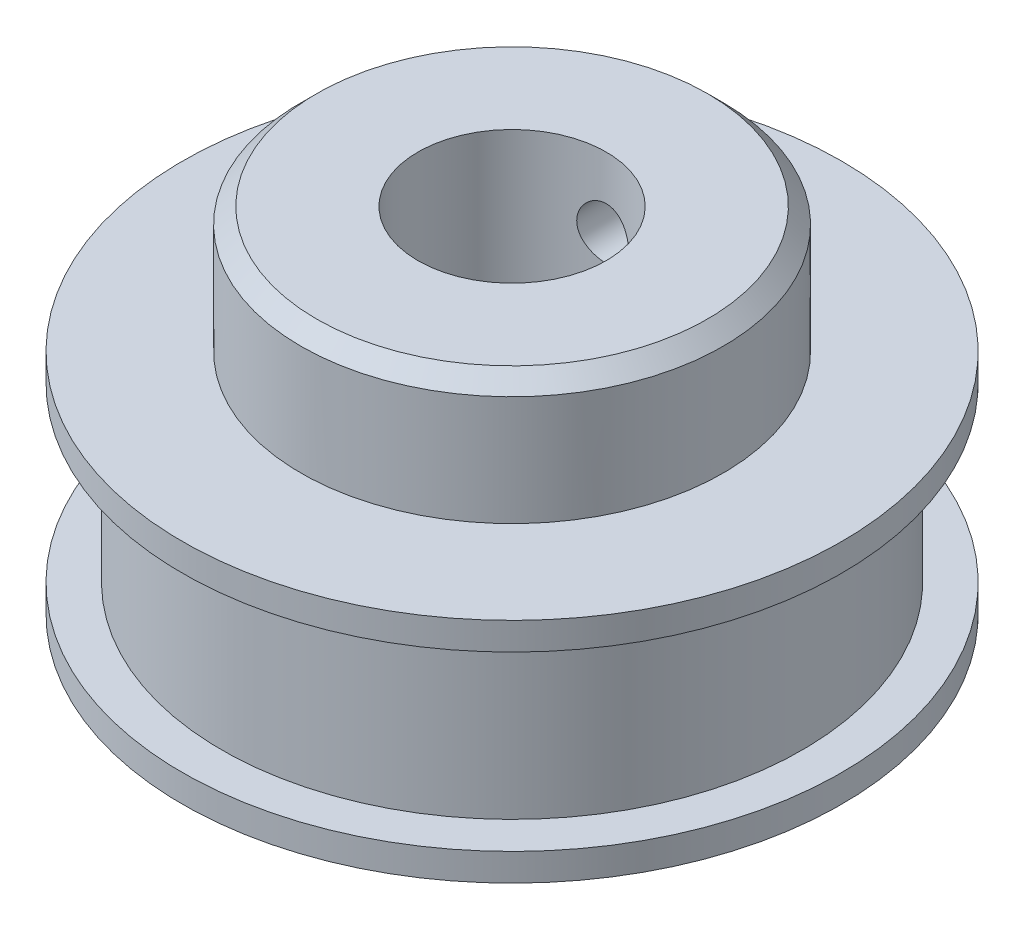
ISO-10303-21;
HEADER;
FILE_DESCRIPTION(('STEP AP214'),'2;1');
FILE_NAME('part.step','',(''),(''),'','','');
FILE_SCHEMA(('AUTOMOTIVE_DESIGN { 1 0 10303 214 1 1 1 1 }'));
ENDSEC;
DATA;
#1=APPLICATION_CONTEXT('core data for automotive mechanical design processes');
#2=APPLICATION_PROTOCOL_DEFINITION('international standard','automotive_design',2000,#1);
#3=PRODUCT_CONTEXT('',#1,'mechanical');
#4=PRODUCT('Part','Part','',(#3));
#5=PRODUCT_RELATED_PRODUCT_CATEGORY('part','',(#4));
#6=PRODUCT_DEFINITION_FORMATION('','',#4);
#7=PRODUCT_DEFINITION_CONTEXT('part definition',#1,'design');
#8=PRODUCT_DEFINITION('design','',#6,#7);
#9=PRODUCT_DEFINITION_SHAPE('','',#8);
#10=(LENGTH_UNIT() NAMED_UNIT(*) SI_UNIT(.MILLI.,.METRE.));
#11=(NAMED_UNIT(*) PLANE_ANGLE_UNIT() SI_UNIT($,.RADIAN.));
#12=(NAMED_UNIT(*) SI_UNIT($,.STERADIAN.) SOLID_ANGLE_UNIT());
#13=UNCERTAINTY_MEASURE_WITH_UNIT(LENGTH_MEASURE(1.E-05),#10,'distance_accuracy_value','');
#14=(GEOMETRIC_REPRESENTATION_CONTEXT(3) GLOBAL_UNCERTAINTY_ASSIGNED_CONTEXT((#13)) GLOBAL_UNIT_ASSIGNED_CONTEXT((#10,
#11,#12)) REPRESENTATION_CONTEXT('',''));
#15=CARTESIAN_POINT('',(0.,0.,0.));
#16=DIRECTION('',(0.,0.,1.));
#17=DIRECTION('',(1.,0.,0.));
#18=AXIS2_PLACEMENT_3D('',#15,#16,#17);
#19=CARTESIAN_POINT('',(0.,11.25,0.));
#20=DIRECTION('',(0.,1.,0.));
#21=DIRECTION('',(0.,0.,1.));
#22=AXIS2_PLACEMENT_3D('',#19,#20,#21);
#23=PLANE('',#22);
#24=CARTESIAN_POINT('',(0.,11.25,0.));
#25=DIRECTION('',(0.,1.,0.));
#26=DIRECTION('',(0.,0.,1.));
#27=AXIS2_PLACEMENT_3D('',#24,#25,#26);
#28=CIRCLE('',#27,6.);
#29=CARTESIAN_POINT('',(0.,11.25,6.));
#30=VERTEX_POINT('',#29);
#31=EDGE_CURVE('E80',#30,#30,#28,.T.);
#32=ORIENTED_EDGE('',*,*,#31,.F.);
#33=EDGE_LOOP('',(#32));
#34=FACE_BOUND('',#33,.T.);
#35=CARTESIAN_POINT('',(0.,11.25,0.));
#36=DIRECTION('',(0.,1.,0.));
#37=DIRECTION('',(0.,0.,1.));
#38=AXIS2_PLACEMENT_3D('',#35,#36,#37);
#39=CIRCLE('',#38,12.45);
#40=CARTESIAN_POINT('',(0.,11.25,12.45));
#41=VERTEX_POINT('',#40);
#42=EDGE_CURVE('E10',#41,#41,#39,.T.);
#43=ORIENTED_EDGE('',*,*,#42,.T.);
#44=EDGE_LOOP('',(#43));
#45=FACE_BOUND('',#44,.T.);
#46=ADVANCED_FACE('F38',(#34,#45),#23,.T.);
#47=CARTESIAN_POINT('',(0.,-12.375,0.));
#48=DIRECTION('',(0.,-1.,0.));
#49=DIRECTION('',(0.,0.,-1.));
#50=AXIS2_PLACEMENT_3D('',#47,#48,#49);
#51=CYLINDRICAL_SURFACE('',#50,13.45);
#52=CARTESIAN_POINT('',(0.,8.4,-13.45));
#53=CARTESIAN_POINT('',(0.0923092606846522,8.39999606989156,-13.4499987318262));
#54=CARTESIAN_POINT('',(0.184676546565116,8.39222752254949,-13.4490396601292));
#55=CARTESIAN_POINT('',(0.366841822033255,8.36135934683921,-13.4453059823572));
#56=CARTESIAN_POINT('',(0.456637010359747,8.33824362017226,-13.4425294699356));
#57=CARTESIAN_POINT('',(0.630994428152322,8.27737154568672,-13.4354737642154));
#58=CARTESIAN_POINT('',(0.715560099781557,8.23962494971325,-13.4311955720033));
#59=CARTESIAN_POINT('',(0.877140082819454,8.15058371541106,-13.4216125888811));
#60=CARTESIAN_POINT('',(0.954155707326011,8.09929143868824,-13.4163079769639));
#61=CARTESIAN_POINT('',(1.09887473843124,7.98432350451151,-13.4052331083348));
#62=CARTESIAN_POINT('',(1.16653227898811,7.92059030725544,-13.3994607638233));
#63=CARTESIAN_POINT('',(1.29021965720093,7.78267316407076,-13.3881178862387));
#64=CARTESIAN_POINT('',(1.3462489080705,7.7084886910672,-13.3825473633617));
#65=CARTESIAN_POINT('',(1.44525931032078,7.55147777239056,-13.3722182299544));
#66=CARTESIAN_POINT('',(1.48819762643743,7.4686241229816,-13.3674623066793));
#67=CARTESIAN_POINT('',(1.55953374744784,7.29681393267107,-13.3593282504242));
#68=CARTESIAN_POINT('',(1.58793208386536,7.20785761499358,-13.3559500670804));
#69=CARTESIAN_POINT('',(1.62924305851266,7.02684254400976,-13.3509738304528));
#70=CARTESIAN_POINT('',(1.64223302212707,6.93480168630368,-13.3493668912592));
#71=CARTESIAN_POINT('',(1.65259776008657,6.74983340414768,-13.3480878588677));
#72=CARTESIAN_POINT('',(1.64997314003763,6.65690601422117,-13.3484156906304));
#73=CARTESIAN_POINT('',(1.62924671453376,6.47334082873499,-13.3509610283831));
#74=CARTESIAN_POINT('',(1.61123000940919,6.3826932599305,-13.3531681438955));
#75=CARTESIAN_POINT('',(1.56036358203791,6.20571796726024,-13.3592071549006));
#76=CARTESIAN_POINT('',(1.52751356938961,6.11939032800538,-13.3630390822031));
#77=CARTESIAN_POINT('',(1.44782129743991,5.95324059148484,-13.3719077551923));
#78=CARTESIAN_POINT('',(1.40094197823018,5.8734364465625,-13.3769476848372));
#79=CARTESIAN_POINT('',(1.29454834829898,5.72279573680187,-13.387662006051));
#80=CARTESIAN_POINT('',(1.23503348084826,5.65195956731714,-13.3933364255707));
#81=CARTESIAN_POINT('',(1.10458615859966,5.52077157990349,-13.4047265640634));
#82=CARTESIAN_POINT('',(1.03358033713523,5.46049269247193,-13.4104423065102));
#83=CARTESIAN_POINT('',(0.882419530715335,5.35269795321998,-13.421235697483));
#84=CARTESIAN_POINT('',(0.802264525964526,5.30518212901474,-13.4263133446283));
#85=CARTESIAN_POINT('',(0.635024999510896,5.22426256591315,-13.4352614196214));
#86=CARTESIAN_POINT('',(0.547938289333149,5.19086330506102,-13.4391314642928));
#87=CARTESIAN_POINT('',(0.3693346923303,5.13918239287224,-13.4452247727249));
#88=CARTESIAN_POINT('',(0.277818005423388,5.12090006000337,-13.4474481107253));
#89=CARTESIAN_POINT('',(0.0935829703302501,5.10006629118723,-13.4499878579134));
#90=CARTESIAN_POINT('',(0.000876146276728533,5.09741437220646,-13.4503164475478));
#91=CARTESIAN_POINT('',(-0.183660609696694,5.10765166184763,-13.4490625385916));
#92=CARTESIAN_POINT('',(-0.275490559549179,5.12054055196202,-13.4474800791678));
#93=CARTESIAN_POINT('',(-0.455371019516503,5.16141012686836,-13.4425894893476));
#94=CARTESIAN_POINT('',(-0.543432556703835,5.18934298804758,-13.4392868284265));
#95=CARTESIAN_POINT('',(-0.713621209965722,5.25945793163178,-13.4313256660794));
#96=CARTESIAN_POINT('',(-0.795748131212371,5.301640481583,-13.4266671201659));
#97=CARTESIAN_POINT('',(-0.952185601351656,5.39930112738369,-13.4164833637743));
#98=CARTESIAN_POINT('',(-1.02645523001572,5.45484432614539,-13.4109539568387));
#99=CARTESIAN_POINT('',(-1.16465376419515,5.57755737276608,-13.3996603848827));
#100=CARTESIAN_POINT('',(-1.2285822747215,5.64472766453039,-13.3938962109055));
#101=CARTESIAN_POINT('',(-1.34463961437588,5.78923038063816,-13.3827452759908));
#102=CARTESIAN_POINT('',(-1.39670190188454,5.86661644582719,-13.377360754952));
#103=CARTESIAN_POINT('',(-1.48708947309349,6.0290932732003,-13.3676153586065));
#104=CARTESIAN_POINT('',(-1.52541502358073,6.11418388571093,-13.3632544634201));
#105=CARTESIAN_POINT('',(-1.58713309499605,6.2894383202972,-13.3560652169377));
#106=CARTESIAN_POINT('',(-1.61056334369739,6.37958869058734,-13.3532329964891));
#107=CARTESIAN_POINT('',(-1.64194730698151,6.56258116743755,-13.3494105895796));
#108=CARTESIAN_POINT('',(-1.64990171292012,6.65542315356641,-13.3484203208328));
#109=CARTESIAN_POINT('',(-1.65009582779569,6.84050149096557,-13.3483962729262));
#110=CARTESIAN_POINT('',(-1.64244007353199,6.93273774839408,-13.3493494788668));
#111=CARTESIAN_POINT('',(-1.61185233199219,7.11460212713943,-13.3530770204912));
#112=CARTESIAN_POINT('',(-1.58892034124114,7.20423024786299,-13.3558513565892));
#113=CARTESIAN_POINT('',(-1.52846338782943,7.37832168451034,-13.3629045779662));
#114=CARTESIAN_POINT('',(-1.49094326479907,7.46278670255674,-13.3671829642298));
#115=CARTESIAN_POINT('',(-1.40238541414801,7.62423855105335,-13.3767630641329));
#116=CARTESIAN_POINT('',(-1.35134754184961,7.70122530145313,-13.3820647887248));
#117=CARTESIAN_POINT('',(-1.23681455747847,7.8460698163772,-13.3931367411319));
#118=CARTESIAN_POINT('',(-1.17324151661805,7.91386575090879,-13.3989097601505));
#119=CARTESIAN_POINT('',(-1.03560482830966,8.03786788561699,-13.4102490819286));
#120=CARTESIAN_POINT('',(-0.961538707336214,8.09407134541484,-13.4158153355559));
#121=CARTESIAN_POINT('',(-0.804707912187814,8.19346753605082,-13.4261363991204));
#122=CARTESIAN_POINT('',(-0.721912336762905,8.23661180141906,-13.4308881586852));
#123=CARTESIAN_POINT('',(-0.550239848962248,8.30832314807712,-13.4390137556234));
#124=CARTESIAN_POINT('',(-0.461369690725895,8.33690612994305,-13.4423890952073));
#125=CARTESIAN_POINT('',(-0.310029334491708,8.37181241152802,-13.4465643492695));
#126=CARTESIAN_POINT('',(-0.248514914853924,8.38236764276486,-13.4478464692165));
#127=CARTESIAN_POINT('',(-0.124675817596508,8.39646273973653,-13.4495647199177));
#128=CARTESIAN_POINT('',(-0.0623511456574501,8.40000265462817,-13.4500008565998));
#129=CARTESIAN_POINT('',(0.,8.4,-13.45));
#130=B_SPLINE_CURVE_WITH_KNOTS('',3,(#52,#53,#54,#55,#56,#57,#58,#59,#60,#61,#62,#63,#64,#65,
#66,#67,#68,#69,#70,#71,#72,#73,#74,#75,#76,#77,#78,#79,#80,#81,#82,#83,#84,#85,#86,#87,#88,#89,
#90,#91,#92,#93,#94,#95,#96,#97,#98,#99,#100,#101,#102,#103,#104,#105,#106,#107,#108,#109,#110,
#111,#112,#113,#114,#115,#116,#117,#118,#119,#120,#121,#122,#123,#124,#125,#126,#127,#128,#129),
.UNSPECIFIED.,.T.,.F.,(4,2,2,2,2,2,2,2,2,2,2,2,2,2,2,2,2,2,2,2,2,2,2,2,2,2,2,2,2,2,2,2,2,2,2,2,
2,2,4),(0.,0.276700039848801,0.553690781475281,0.830497218348917,1.10725542755036,
1.38532535416116,1.66340930931717,1.94239366032399,2.2213678120454,2.49893595553601,
2.77649333371692,3.0525260004692,3.3285640715321,3.60533786155207,3.88212384890976,
4.16075232836323,4.4393814106739,4.7180988132492,4.99680364943228,5.27371480831541,
5.55062029202468,5.8266506661095,6.10269009790101,6.38010286050754,6.65752621666219,
6.93646895544387,7.21540627646803,7.49363424238483,7.7718497786754,8.04820830450432,
8.32456689319753,8.60083387771954,8.87710381919007,9.15514874581255,9.43325932514204,
9.71238972281186,9.99121465982896,10.1781155758501,10.3650151822392),.UNSPECIFIED.);
#131=CARTESIAN_POINT('',(0.,8.4,-13.45));
#132=VERTEX_POINT('',#131);
#133=EDGE_CURVE('E83',#132,#132,#130,.T.);
#134=ORIENTED_EDGE('',*,*,#133,.F.);
#135=EDGE_LOOP('',(#134));
#136=FACE_BOUND('',#135,.T.);
#137=CARTESIAN_POINT('',(0.,10.25,0.));
#138=DIRECTION('',(0.,1.,0.));
#139=DIRECTION('',(0.,0.,1.));
#140=AXIS2_PLACEMENT_3D('',#137,#138,#139);
#141=CIRCLE('',#140,13.45);
#142=CARTESIAN_POINT('',(0.,10.25,13.45));
#143=VERTEX_POINT('',#142);
#144=EDGE_CURVE('E52',#143,#143,#141,.F.);
#145=ORIENTED_EDGE('',*,*,#144,.T.);
#146=EDGE_LOOP('',(#145));
#147=FACE_BOUND('',#146,.T.);
#148=CARTESIAN_POINT('',(0.,3.25,0.));
#149=DIRECTION('',(0.,-1.,0.));
#150=DIRECTION('',(0.,0.,-1.));
#151=AXIS2_PLACEMENT_3D('',#148,#149,#150);
#152=CIRCLE('',#151,13.45);
#153=CARTESIAN_POINT('',(0.,3.25,-13.45));
#154=VERTEX_POINT('',#153);
#155=EDGE_CURVE('E56',#154,#154,#152,.T.);
#156=ORIENTED_EDGE('',*,*,#155,.F.);
#157=EDGE_LOOP('',(#156));
#158=FACE_BOUND('',#157,.T.);
#159=ADVANCED_FACE('F91',(#136,#147,#158),#51,.T.);
#160=CARTESIAN_POINT('',(13.45,3.25,0.));
#161=DIRECTION('',(0.,1.,0.));
#162=DIRECTION('',(0.,0.,1.));
#163=AXIS2_PLACEMENT_3D('',#160,#161,#162);
#164=PLANE('',#163);
#165=ORIENTED_EDGE('',*,*,#155,.T.);
#166=EDGE_LOOP('',(#165));
#167=FACE_BOUND('',#166,.T.);
#168=CARTESIAN_POINT('',(0.,3.25,0.));
#169=DIRECTION('',(0.,-1.,0.));
#170=DIRECTION('',(0.,0.,-1.));
#171=AXIS2_PLACEMENT_3D('',#168,#169,#170);
#172=CIRCLE('',#171,21.);
#173=CARTESIAN_POINT('',(0.,3.25,-21.));
#174=VERTEX_POINT('',#173);
#175=EDGE_CURVE('E61',#174,#174,#172,.T.);
#176=ORIENTED_EDGE('',*,*,#175,.F.);
#177=EDGE_LOOP('',(#176));
#178=FACE_BOUND('',#177,.T.);
#179=ADVANCED_FACE('F126',(#167,#178),#164,.T.);
#180=CARTESIAN_POINT('',(0.,-12.375,0.));
#181=DIRECTION('',(0.,-1.,0.));
#182=DIRECTION('',(0.,0.,-1.));
#183=AXIS2_PLACEMENT_3D('',#180,#181,#182);
#184=CYLINDRICAL_SURFACE('',#183,21.);
#185=ORIENTED_EDGE('',*,*,#175,.T.);
#186=EDGE_LOOP('',(#185));
#187=FACE_BOUND('',#186,.T.);
#188=CARTESIAN_POINT('',(0.,1.5,0.));
#189=DIRECTION('',(0.,-1.,0.));
#190=DIRECTION('',(0.,0.,-1.));
#191=AXIS2_PLACEMENT_3D('',#188,#189,#190);
#192=CIRCLE('',#191,21.);
#193=CARTESIAN_POINT('',(0.,1.5,-21.));
#194=VERTEX_POINT('',#193);
#195=EDGE_CURVE('E64',#194,#194,#192,.T.);
#196=ORIENTED_EDGE('',*,*,#195,.F.);
#197=EDGE_LOOP('',(#196));
#198=FACE_BOUND('',#197,.T.);
#199=ADVANCED_FACE('F123',(#187,#198),#184,.T.);
#200=CARTESIAN_POINT('',(21.,1.5,0.));
#201=DIRECTION('',(0.,-1.,0.));
#202=DIRECTION('',(0.,0.,-1.));
#203=AXIS2_PLACEMENT_3D('',#200,#201,#202);
#204=PLANE('',#203);
#205=ORIENTED_EDGE('',*,*,#195,.T.);
#206=EDGE_LOOP('',(#205));
#207=FACE_BOUND('',#206,.T.);
#208=CARTESIAN_POINT('',(0.,1.5,0.));
#209=DIRECTION('',(0.,-1.,0.));
#210=DIRECTION('',(0.,0.,-1.));
#211=AXIS2_PLACEMENT_3D('',#208,#209,#210);
#212=CIRCLE('',#211,18.5);
#213=CARTESIAN_POINT('',(0.,1.5,-18.5));
#214=VERTEX_POINT('',#213);
#215=EDGE_CURVE('E67',#214,#214,#212,.T.);
#216=ORIENTED_EDGE('',*,*,#215,.F.);
#217=EDGE_LOOP('',(#216));
#218=FACE_BOUND('',#217,.T.);
#219=ADVANCED_FACE('F119',(#207,#218),#204,.T.);
#220=CARTESIAN_POINT('',(0.,-12.375,0.));
#221=DIRECTION('',(0.,-1.,0.));
#222=DIRECTION('',(0.,0.,-1.));
#223=AXIS2_PLACEMENT_3D('',#220,#221,#222);
#224=CYLINDRICAL_SURFACE('',#223,18.5);
#225=ORIENTED_EDGE('',*,*,#215,.T.);
#226=EDGE_LOOP('',(#225));
#227=FACE_BOUND('',#226,.T.);
#228=CARTESIAN_POINT('',(0.,-9.5,0.));
#229=DIRECTION('',(0.,-1.,0.));
#230=DIRECTION('',(0.,0.,-1.));
#231=AXIS2_PLACEMENT_3D('',#228,#229,#230);
#232=CIRCLE('',#231,18.5);
#233=CARTESIAN_POINT('',(0.,-9.5,-18.5));
#234=VERTEX_POINT('',#233);
#235=EDGE_CURVE('E70',#234,#234,#232,.T.);
#236=ORIENTED_EDGE('',*,*,#235,.F.);
#237=EDGE_LOOP('',(#236));
#238=FACE_BOUND('',#237,.T.);
#239=ADVANCED_FACE('F115',(#227,#238),#224,.T.);
#240=CARTESIAN_POINT('',(18.5,-9.5,0.));
#241=DIRECTION('',(0.,1.,0.));
#242=DIRECTION('',(0.,0.,1.));
#243=AXIS2_PLACEMENT_3D('',#240,#241,#242);
#244=PLANE('',#243);
#245=ORIENTED_EDGE('',*,*,#235,.T.);
#246=EDGE_LOOP('',(#245));
#247=FACE_BOUND('',#246,.T.);
#248=CARTESIAN_POINT('',(0.,-9.5,0.));
#249=DIRECTION('',(0.,-1.,0.));
#250=DIRECTION('',(0.,0.,-1.));
#251=AXIS2_PLACEMENT_3D('',#248,#249,#250);
#252=CIRCLE('',#251,21.);
#253=CARTESIAN_POINT('',(0.,-9.5,-21.));
#254=VERTEX_POINT('',#253);
#255=EDGE_CURVE('E73',#254,#254,#252,.T.);
#256=ORIENTED_EDGE('',*,*,#255,.F.);
#257=EDGE_LOOP('',(#256));
#258=FACE_BOUND('',#257,.T.);
#259=ADVANCED_FACE('F111',(#247,#258),#244,.T.);
#260=CARTESIAN_POINT('',(0.,-12.375,0.));
#261=DIRECTION('',(0.,-1.,0.));
#262=DIRECTION('',(0.,0.,-1.));
#263=AXIS2_PLACEMENT_3D('',#260,#261,#262);
#264=CYLINDRICAL_SURFACE('',#263,21.);
#265=ORIENTED_EDGE('',*,*,#255,.T.);
#266=EDGE_LOOP('',(#265));
#267=FACE_BOUND('',#266,.T.);
#268=CARTESIAN_POINT('',(0.,-11.25,0.));
#269=DIRECTION('',(0.,-1.,0.));
#270=DIRECTION('',(0.,0.,-1.));
#271=AXIS2_PLACEMENT_3D('',#268,#269,#270);
#272=CIRCLE('',#271,21.);
#273=CARTESIAN_POINT('',(0.,-11.25,-21.));
#274=VERTEX_POINT('',#273);
#275=EDGE_CURVE('E76',#274,#274,#272,.T.);
#276=ORIENTED_EDGE('',*,*,#275,.F.);
#277=EDGE_LOOP('',(#276));
#278=FACE_BOUND('',#277,.T.);
#279=ADVANCED_FACE('F107',(#267,#278),#264,.T.);
#280=CARTESIAN_POINT('',(21.,-11.25,0.));
#281=DIRECTION('',(0.,-1.,0.));
#282=DIRECTION('',(0.,0.,-1.));
#283=AXIS2_PLACEMENT_3D('',#280,#281,#282);
#284=PLANE('',#283);
#285=CARTESIAN_POINT('',(0.,-11.25,0.));
#286=DIRECTION('',(0.,1.,0.));
#287=DIRECTION('',(0.,0.,1.));
#288=AXIS2_PLACEMENT_3D('',#285,#286,#287);
#289=CIRCLE('',#288,6.);
#290=CARTESIAN_POINT('',(0.,-11.25,6.));
#291=VERTEX_POINT('',#290);
#292=EDGE_CURVE('E79',#291,#291,#289,.T.);
#293=ORIENTED_EDGE('',*,*,#292,.T.);
#294=EDGE_LOOP('',(#293));
#295=FACE_BOUND('',#294,.T.);
#296=ORIENTED_EDGE('',*,*,#275,.T.);
#297=EDGE_LOOP('',(#296));
#298=FACE_BOUND('',#297,.T.);
#299=ADVANCED_FACE('F104',(#295,#298),#284,.T.);
#300=CARTESIAN_POINT('',(0.,10.25,0.));
#301=DIRECTION('',(0.,-1.,0.));
#302=DIRECTION('',(0.,0.,-1.));
#303=AXIS2_PLACEMENT_3D('',#300,#301,#302);
#304=CONICAL_SURFACE('',#303,13.45,0.785398163397452);
#305=ORIENTED_EDGE('',*,*,#42,.F.);
#306=EDGE_LOOP('',(#305));
#307=FACE_BOUND('',#306,.T.);
#308=ORIENTED_EDGE('',*,*,#144,.F.);
#309=EDGE_LOOP('',(#308));
#310=FACE_BOUND('',#309,.T.);
#311=ADVANCED_FACE('F41',(#307,#310),#304,.T.);
#312=CARTESIAN_POINT('',(0.,-11.25,0.));
#313=DIRECTION('',(0.,1.,0.));
#314=DIRECTION('',(0.,0.,1.));
#315=AXIS2_PLACEMENT_3D('',#312,#313,#314);
#316=CYLINDRICAL_SURFACE('',#315,6.);
#317=CARTESIAN_POINT('',(1.65,6.75,-5.76866535690882));
#318=CARTESIAN_POINT('',(1.64999803744472,6.65921955335825,-5.76866681542244));
#319=CARTESIAN_POINT('',(1.64248258154128,6.56841876938433,-5.77083168489651));
#320=CARTESIAN_POINT('',(1.61268113160831,6.38944729227741,-5.77922931898767));
#321=CARTESIAN_POINT('',(1.59038833565189,6.30127782986673,-5.78546395687621));
#322=CARTESIAN_POINT('',(1.53182668713213,6.13018421281183,-5.8012427959002));
#323=CARTESIAN_POINT('',(1.49557833657748,6.04725257039649,-5.81078214006462));
#324=CARTESIAN_POINT('',(1.4101995918537,5.88863278184509,-5.83208926824761));
#325=CARTESIAN_POINT('',(1.36106796655278,5.81294532891123,-5.84385726520744));
#326=CARTESIAN_POINT('',(1.24991964518898,5.66894953768282,-5.8686465288998));
#327=CARTESIAN_POINT('',(1.1876215346316,5.60086238877202,-5.88169112663028));
#328=CARTESIAN_POINT('',(1.05251338107009,5.47595879824098,-5.90736293037452));
#329=CARTESIAN_POINT('',(0.979702190581917,5.41914358854209,-5.91999009064058));
#330=CARTESIAN_POINT('',(0.824091417921744,5.31746519622698,-5.94366575662943));
#331=CARTESIAN_POINT('',(0.741142186315805,5.27282326362092,-5.9546835378627));
#332=CARTESIAN_POINT('',(0.568561338575523,5.19820386122523,-5.9736305376139));
#333=CARTESIAN_POINT('',(0.478930927041655,5.16822375527836,-5.98156031129505));
#334=CARTESIAN_POINT('',(0.297842110789118,5.12449875531735,-5.99327282902113));
#335=CARTESIAN_POINT('',(0.206480953697208,5.1103772839833,-5.99715160352105));
#336=CARTESIAN_POINT('',(0.0226094627200633,5.09758420132032,-6.00066142983201));
#337=CARTESIAN_POINT('',(-0.069900664177604,5.09890984638381,-6.00029323595966));
#338=CARTESIAN_POINT('',(-0.250818004668653,5.11671114639083,-5.99542038051176));
#339=CARTESIAN_POINT('',(-0.339268726185946,5.13277972798328,-5.9910268682886));
#340=CARTESIAN_POINT('',(-0.512166240031457,5.1789513845931,-5.97872912336679));
#341=CARTESIAN_POINT('',(-0.596612796751147,5.20905528433458,-5.97082468436519));
#342=CARTESIAN_POINT('',(-0.76012676990918,5.28274614554668,-5.95223107363847));
#343=CARTESIAN_POINT('',(-0.839129261966644,5.32646980011384,-5.94151385162518));
#344=CARTESIAN_POINT('',(-0.98881252858886,5.42605339164662,-5.91844520458616));
#345=CARTESIAN_POINT('',(-1.05949158844747,5.48191582259504,-5.90609344393908));
#346=CARTESIAN_POINT('',(-1.19295184933328,5.60634061131931,-5.88061532945822));
#347=CARTESIAN_POINT('',(-1.25540056574357,5.6752575455875,-5.86747685059754));
#348=CARTESIAN_POINT('',(-1.36793848619848,5.82272042191696,-5.84226662316507));
#349=CARTESIAN_POINT('',(-1.41802683438026,5.90126703019763,-5.83019494849858));
#350=CARTESIAN_POINT('',(-1.50469703763152,6.06651707691904,-5.80843406835838));
#351=CARTESIAN_POINT('',(-1.54118305341272,6.15327318726382,-5.79876192329638));
#352=CARTESIAN_POINT('',(-1.59894009136597,6.3320216149048,-5.78310436235825));
#353=CARTESIAN_POINT('',(-1.6202151643252,6.42401253108294,-5.77711796499911));
#354=CARTESIAN_POINT('',(-1.64636178324791,6.60749641079511,-5.76972035320552));
#355=CARTESIAN_POINT('',(-1.6517315769404,6.69891284793571,-5.76817022285768));
#356=CARTESIAN_POINT('',(-1.64729247824813,6.88133853039987,-5.76943959387622));
#357=CARTESIAN_POINT('',(-1.63748531887186,6.9723478210242,-5.77225859634513));
#358=CARTESIAN_POINT('',(-1.60341110080102,7.14941887867531,-5.78181388299926));
#359=CARTESIAN_POINT('',(-1.57944858294857,7.23554414327791,-5.78846759511703));
#360=CARTESIAN_POINT('',(-1.51808880834984,7.40255168321551,-5.80486075000444));
#361=CARTESIAN_POINT('',(-1.48068971625608,7.48343324051216,-5.81460061430066));
#362=CARTESIAN_POINT('',(-1.39252303885361,7.6397280941801,-5.83634995588392));
#363=CARTESIAN_POINT('',(-1.3414656422839,7.71497115812137,-5.84840681329183));
#364=CARTESIAN_POINT('',(-1.22778724402409,7.85600436259986,-5.87332256443653));
#365=CARTESIAN_POINT('',(-1.16516392562852,7.92179260459153,-5.88618161851454));
#366=CARTESIAN_POINT('',(-1.02781750590111,8.04414335503753,-5.91173499394533));
#367=CARTESIAN_POINT('',(-0.952779703449053,8.10035698500714,-5.92441187573805));
#368=CARTESIAN_POINT('',(-0.794045946471827,8.19939303044249,-5.94776568995451));
#369=CARTESIAN_POINT('',(-0.710350452233262,8.24221615732853,-5.95844272861526));
#370=CARTESIAN_POINT('',(-0.537265018353871,8.31285441331323,-5.97652506377789));
#371=CARTESIAN_POINT('',(-0.447923954411465,8.34078270093574,-5.98395494908837));
#372=CARTESIAN_POINT('',(-0.26558031797526,8.38115951696826,-5.99481425560821));
#373=CARTESIAN_POINT('',(-0.17257861793735,8.39361171109341,-5.99824462414353));
#374=CARTESIAN_POINT('',(0.0111958773090386,8.40244119041157,-6.00067051691051));
#375=CARTESIAN_POINT('',(0.101942634810787,8.39932873226352,-5.99980681919578));
#376=CARTESIAN_POINT('',(0.281569554656672,8.3783104181902,-5.99406321514946));
#377=CARTESIAN_POINT('',(0.370449795011799,8.36040518179519,-5.98918347701204));
#378=CARTESIAN_POINT('',(0.543165745839334,8.31060523911145,-5.97598710157647));
#379=CARTESIAN_POINT('',(0.627035168123881,8.27881985190943,-5.9676973503156));
#380=CARTESIAN_POINT('',(0.78829796642039,8.20225916736823,-5.94854501555121));
#381=CARTESIAN_POINT('',(0.865690389200818,8.15748196231652,-5.93768205424174));
#382=CARTESIAN_POINT('',(1.01415403207422,8.05474796401359,-5.91416124461071));
#383=CARTESIAN_POINT('',(1.08498744614408,7.99645711073664,-5.90146164079605));
#384=CARTESIAN_POINT('',(1.21603947801472,7.86897627356031,-5.87585872928397));
#385=CARTESIAN_POINT('',(1.27625523789272,7.79978336464786,-5.86295536775691));
#386=CARTESIAN_POINT('',(1.38578701268237,7.65048219479949,-5.83805027961809));
#387=CARTESIAN_POINT('',(1.43480949541506,7.57015333678291,-5.82607732195824));
#388=CARTESIAN_POINT('',(1.51858609627288,7.40207439398108,-5.80480632889601));
#389=CARTESIAN_POINT('',(1.55334897834329,7.31432890757189,-5.79550665155144));
#390=CARTESIAN_POINT('',(1.6034019574589,7.14750366779767,-5.78183943348555));
#391=CARTESIAN_POINT('',(1.62083357797553,7.06910375198115,-5.77694065884767));
#392=CARTESIAN_POINT('',(1.64413270596966,6.91047435965551,-5.77035318708946));
#393=CARTESIAN_POINT('',(1.65000173479533,6.83024512524438,-5.76866406765973));
#394=CARTESIAN_POINT('',(1.65,6.75,-5.76866535690882));
#395=B_SPLINE_CURVE_WITH_KNOTS('',3,(#317,#318,#319,#320,#321,#322,#323,#324,#325,#326,#327,
#328,#329,#330,#331,#332,#333,#334,#335,#336,#337,#338,#339,#340,#341,#342,#343,#344,#345,#346,
#347,#348,#349,#350,#351,#352,#353,#354,#355,#356,#357,#358,#359,#360,#361,#362,#363,#364,#365,
#366,#367,#368,#369,#370,#371,#372,#373,#374,#375,#376,#377,#378,#379,#380,#381,#382,#383,#384,
#385,#386,#387,#388,#389,#390,#391,#392,#393,#394),.UNSPECIFIED.,.T.,.F.,(4,2,2,2,2,2,2,2,2,2,2,
2,2,2,2,2,2,2,2,2,2,2,2,2,2,2,2,2,2,2,2,2,2,2,2,2,2,2,4),(0.,0.272046051104015,0.54421741051563,
0.815990441281184,1.08778945227587,1.36612384486572,1.64448864015853,1.92761862185042,
2.21069767879603,2.48690242321262,2.76305811084345,3.03181099442101,3.30057967207718,
3.57213780160766,3.84375177719016,4.12421818647043,4.40470401050125,4.68713031851458,
4.96948138625911,5.24288876991941,5.5162649363549,5.78396348444837,6.0516986123097,
6.32564040616629,6.59963713140791,6.88212071608134,7.16458929021235,7.44488018041167,
7.72510466738726,7.9962039644357,8.2672919082614,8.53628224078241,8.80531209172669,
9.08187822938626,9.35851869627828,9.64174339988021,9.92479377192829,10.1652997746179,
10.4057741306126),.UNSPECIFIED.);
#396=CARTESIAN_POINT('',(1.65,6.75,-5.76866535690882));
#397=VERTEX_POINT('',#396);
#398=EDGE_CURVE('E43',#397,#397,#395,.T.);
#399=ORIENTED_EDGE('',*,*,#398,.T.);
#400=EDGE_LOOP('',(#399));
#401=FACE_BOUND('',#400,.T.);
#402=ORIENTED_EDGE('',*,*,#292,.F.);
#403=EDGE_LOOP('',(#402));
#404=FACE_BOUND('',#403,.T.);
#405=ORIENTED_EDGE('',*,*,#31,.T.);
#406=EDGE_LOOP('',(#405));
#407=FACE_BOUND('',#406,.T.);
#408=ADVANCED_FACE('F97',(#401,#404,#407),#316,.F.);
#409=CARTESIAN_POINT('',(0.,6.75,-21.));
#410=DIRECTION('',(0.,0.,1.));
#411=DIRECTION('',(1.,0.,0.));
#412=AXIS2_PLACEMENT_3D('',#409,#410,#411);
#413=CYLINDRICAL_SURFACE('',#412,1.65);
#414=ORIENTED_EDGE('',*,*,#133,.T.);
#415=EDGE_LOOP('',(#414));
#416=FACE_BOUND('',#415,.T.);
#417=ORIENTED_EDGE('',*,*,#398,.F.);
#418=EDGE_LOOP('',(#417));
#419=FACE_BOUND('',#418,.T.);
#420=ADVANCED_FACE('F94',(#416,#419),#413,.F.);
#421=CLOSED_SHELL('',(#46,#159,#179,#199,#219,#239,#259,#279,#299,#311,#408,#420));
#422=MANIFOLD_SOLID_BREP('B2',#421);
#423=ADVANCED_BREP_SHAPE_REPRESENTATION('',(#18,#422),#14);
#424=SHAPE_DEFINITION_REPRESENTATION(#9,#423);
ENDSEC;
END-ISO-10303-21;
